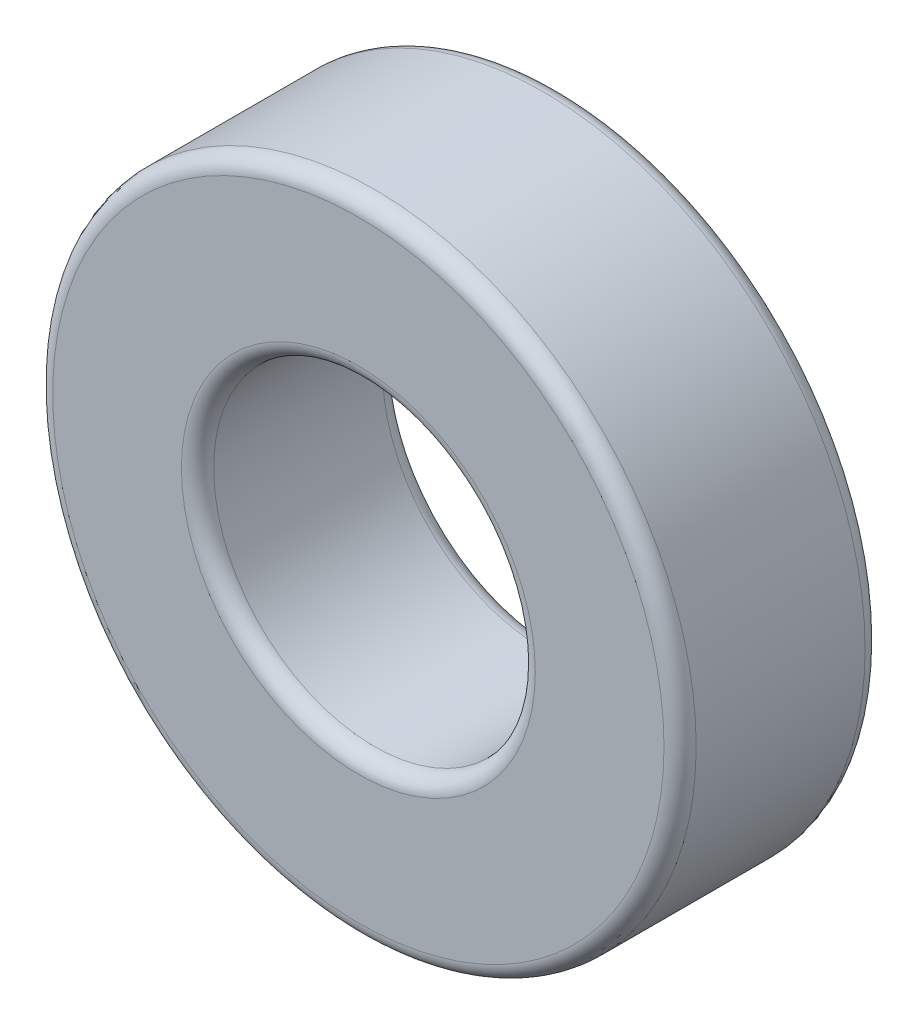
ISO-10303-21;
HEADER;
FILE_DESCRIPTION(('STEP AP214'),'2;1');
FILE_NAME('part.step','',(''),(''),'','','');
FILE_SCHEMA(('AUTOMOTIVE_DESIGN { 1 0 10303 214 1 1 1 1 }'));
ENDSEC;
DATA;
#1=APPLICATION_CONTEXT('core data for automotive mechanical design processes');
#2=APPLICATION_PROTOCOL_DEFINITION('international standard','automotive_design',2000,#1);
#3=PRODUCT_CONTEXT('',#1,'mechanical');
#4=PRODUCT('Part','Part','',(#3));
#5=PRODUCT_RELATED_PRODUCT_CATEGORY('part','',(#4));
#6=PRODUCT_DEFINITION_FORMATION('','',#4);
#7=PRODUCT_DEFINITION_CONTEXT('part definition',#1,'design');
#8=PRODUCT_DEFINITION('design','',#6,#7);
#9=PRODUCT_DEFINITION_SHAPE('','',#8);
#10=(LENGTH_UNIT() NAMED_UNIT(*) SI_UNIT(.MILLI.,.METRE.));
#11=(NAMED_UNIT(*) PLANE_ANGLE_UNIT() SI_UNIT($,.RADIAN.));
#12=(NAMED_UNIT(*) SI_UNIT($,.STERADIAN.) SOLID_ANGLE_UNIT());
#13=UNCERTAINTY_MEASURE_WITH_UNIT(LENGTH_MEASURE(1.E-05),#10,'distance_accuracy_value','');
#14=(GEOMETRIC_REPRESENTATION_CONTEXT(3) GLOBAL_UNCERTAINTY_ASSIGNED_CONTEXT((#13)) GLOBAL_UNIT_ASSIGNED_CONTEXT((#10,
#11,#12)) REPRESENTATION_CONTEXT('',''));
#15=CARTESIAN_POINT('',(0.,0.,0.));
#16=DIRECTION('',(0.,0.,1.));
#17=DIRECTION('',(1.,0.,0.));
#18=AXIS2_PLACEMENT_3D('',#15,#16,#17);
#19=CARTESIAN_POINT('',(60.3855008959128,2.91523939342328,2.5));
#20=DIRECTION('',(0.,0.,-1.));
#21=DIRECTION('',(-1.,0.,0.));
#22=AXIS2_PLACEMENT_3D('',#19,#20,#21);
#23=CYLINDRICAL_SURFACE('',#22,4.00000000000001);
#24=CARTESIAN_POINT('',(60.3855008959128,2.91523939342328,2.3));
#25=DIRECTION('',(0.,0.,1.));
#26=DIRECTION('',(1.,0.,0.));
#27=AXIS2_PLACEMENT_3D('',#24,#25,#26);
#28=CIRCLE('',#27,4.00000000000001);
#29=CARTESIAN_POINT('',(64.3855008959128,2.91523939342328,2.3));
#30=VERTEX_POINT('',#29);
#31=EDGE_CURVE('E43',#30,#30,#28,.F.);
#32=ORIENTED_EDGE('',*,*,#31,.T.);
#33=EDGE_LOOP('',(#32));
#34=FACE_BOUND('',#33,.T.);
#35=CARTESIAN_POINT('',(60.3855008959128,2.91523939342328,0.2));
#36=DIRECTION('',(0.,0.,1.));
#37=DIRECTION('',(1.,0.,0.));
#38=AXIS2_PLACEMENT_3D('',#35,#36,#37);
#39=CIRCLE('',#38,4.00000000000001);
#40=CARTESIAN_POINT('',(64.3855008959128,2.91523939342328,0.2));
#41=VERTEX_POINT('',#40);
#42=EDGE_CURVE('E47',#41,#41,#39,.T.);
#43=ORIENTED_EDGE('',*,*,#42,.T.);
#44=EDGE_LOOP('',(#43));
#45=FACE_BOUND('',#44,.T.);
#46=ADVANCED_FACE('F32',(#34,#45),#23,.T.);
#47=CARTESIAN_POINT('',(60.3855008959128,2.91523939342328,2.5));
#48=DIRECTION('',(0.,0.,1.));
#49=DIRECTION('',(1.,0.,0.));
#50=AXIS2_PLACEMENT_3D('',#47,#48,#49);
#51=PLANE('',#50);
#52=CARTESIAN_POINT('',(60.3855008959128,2.91523939342328,2.5));
#53=DIRECTION('',(0.,0.,1.));
#54=DIRECTION('',(1.,0.,0.));
#55=AXIS2_PLACEMENT_3D('',#52,#53,#54);
#56=CIRCLE('',#55,2.2);
#57=CARTESIAN_POINT('',(62.5855008959128,2.91523939342328,2.5));
#58=VERTEX_POINT('',#57);
#59=EDGE_CURVE('E52',#58,#58,#56,.F.);
#60=ORIENTED_EDGE('',*,*,#59,.T.);
#61=EDGE_LOOP('',(#60));
#62=FACE_BOUND('',#61,.T.);
#63=CARTESIAN_POINT('',(60.3855008959128,2.91523939342328,2.5));
#64=DIRECTION('',(0.,0.,1.));
#65=DIRECTION('',(1.,0.,0.));
#66=AXIS2_PLACEMENT_3D('',#63,#64,#65);
#67=CIRCLE('',#66,3.80000000000001);
#68=CARTESIAN_POINT('',(64.1855008959128,2.91523939342328,2.5));
#69=VERTEX_POINT('',#68);
#70=EDGE_CURVE('E55',#69,#69,#67,.T.);
#71=ORIENTED_EDGE('',*,*,#70,.T.);
#72=EDGE_LOOP('',(#71));
#73=FACE_BOUND('',#72,.T.);
#74=ADVANCED_FACE('F80',(#62,#73),#51,.T.);
#75=CARTESIAN_POINT('',(60.3855008959128,2.91523939342328,0.));
#76=DIRECTION('',(0.,0.,1.));
#77=DIRECTION('',(1.,0.,0.));
#78=AXIS2_PLACEMENT_3D('',#75,#76,#77);
#79=PLANE('',#78);
#80=CARTESIAN_POINT('',(60.3855008959128,2.91523939342328,0.));
#81=DIRECTION('',(0.,0.,1.));
#82=DIRECTION('',(1.,0.,0.));
#83=AXIS2_PLACEMENT_3D('',#80,#81,#82);
#84=CIRCLE('',#83,2.2);
#85=CARTESIAN_POINT('',(62.5855008959128,2.91523939342328,0.));
#86=VERTEX_POINT('',#85);
#87=EDGE_CURVE('E10',#86,#86,#84,.T.);
#88=ORIENTED_EDGE('',*,*,#87,.T.);
#89=EDGE_LOOP('',(#88));
#90=FACE_BOUND('',#89,.T.);
#91=CARTESIAN_POINT('',(60.3855008959128,2.91523939342328,0.));
#92=DIRECTION('',(0.,0.,1.));
#93=DIRECTION('',(1.,0.,0.));
#94=AXIS2_PLACEMENT_3D('',#91,#92,#93);
#95=CIRCLE('',#94,3.80000000000001);
#96=CARTESIAN_POINT('',(64.1855008959128,2.91523939342328,0.));
#97=VERTEX_POINT('',#96);
#98=EDGE_CURVE('E39',#97,#97,#95,.F.);
#99=ORIENTED_EDGE('',*,*,#98,.T.);
#100=EDGE_LOOP('',(#99));
#101=FACE_BOUND('',#100,.T.);
#102=ADVANCED_FACE('F86',(#90,#101),#79,.F.);
#103=CARTESIAN_POINT('',(60.3855008959128,2.91523939342328,4.));
#104=DIRECTION('',(0.,0.,-1.));
#105=DIRECTION('',(-1.,0.,0.));
#106=AXIS2_PLACEMENT_3D('',#103,#104,#105);
#107=CYLINDRICAL_SURFACE('',#106,2.);
#108=CARTESIAN_POINT('',(60.3855008959128,2.91523939342328,2.3));
#109=DIRECTION('',(0.,0.,1.));
#110=DIRECTION('',(1.,0.,0.));
#111=AXIS2_PLACEMENT_3D('',#108,#109,#110);
#112=CIRCLE('',#111,2.);
#113=CARTESIAN_POINT('',(62.3855008959128,2.91523939342328,2.3));
#114=VERTEX_POINT('',#113);
#115=EDGE_CURVE('E58',#114,#114,#112,.T.);
#116=ORIENTED_EDGE('',*,*,#115,.T.);
#117=EDGE_LOOP('',(#116));
#118=FACE_BOUND('',#117,.T.);
#119=CARTESIAN_POINT('',(60.3855008959128,2.91523939342328,0.2));
#120=DIRECTION('',(0.,0.,1.));
#121=DIRECTION('',(1.,0.,0.));
#122=AXIS2_PLACEMENT_3D('',#119,#120,#121);
#123=CIRCLE('',#122,2.);
#124=CARTESIAN_POINT('',(62.3855008959128,2.91523939342328,0.2));
#125=VERTEX_POINT('',#124);
#126=EDGE_CURVE('E61',#125,#125,#123,.F.);
#127=ORIENTED_EDGE('',*,*,#126,.T.);
#128=EDGE_LOOP('',(#127));
#129=FACE_BOUND('',#128,.T.);
#130=ADVANCED_FACE('F65',(#118,#129),#107,.F.);
#131=CARTESIAN_POINT('',(60.3855008959128,2.91523939342328,2.3));
#132=DIRECTION('',(0.,0.,1.));
#133=DIRECTION('',(1.,0.,0.));
#134=AXIS2_PLACEMENT_3D('',#131,#132,#133);
#135=TOROIDAL_SURFACE('',#134,2.2,0.2);
#136=ORIENTED_EDGE('',*,*,#59,.F.);
#137=EDGE_LOOP('',(#136));
#138=FACE_BOUND('',#137,.T.);
#139=ORIENTED_EDGE('',*,*,#115,.F.);
#140=EDGE_LOOP('',(#139));
#141=FACE_BOUND('',#140,.T.);
#142=ADVANCED_FACE('F76',(#138,#141),#135,.T.);
#143=CARTESIAN_POINT('',(60.3855008959128,2.91523939342328,2.3));
#144=DIRECTION('',(0.,0.,1.));
#145=DIRECTION('',(1.,0.,0.));
#146=AXIS2_PLACEMENT_3D('',#143,#144,#145);
#147=TOROIDAL_SURFACE('',#146,3.80000000000001,0.2);
#148=ORIENTED_EDGE('',*,*,#31,.F.);
#149=EDGE_LOOP('',(#148));
#150=FACE_BOUND('',#149,.T.);
#151=ORIENTED_EDGE('',*,*,#70,.F.);
#152=EDGE_LOOP('',(#151));
#153=FACE_BOUND('',#152,.T.);
#154=ADVANCED_FACE('F69',(#150,#153),#147,.T.);
#155=CARTESIAN_POINT('',(60.3855008959128,2.91523939342328,0.2));
#156=DIRECTION('',(0.,0.,1.));
#157=DIRECTION('',(1.,0.,0.));
#158=AXIS2_PLACEMENT_3D('',#155,#156,#157);
#159=TOROIDAL_SURFACE('',#158,2.2,0.2);
#160=ORIENTED_EDGE('',*,*,#87,.F.);
#161=EDGE_LOOP('',(#160));
#162=FACE_BOUND('',#161,.T.);
#163=ORIENTED_EDGE('',*,*,#126,.F.);
#164=EDGE_LOOP('',(#163));
#165=FACE_BOUND('',#164,.T.);
#166=ADVANCED_FACE('F67',(#162,#165),#159,.T.);
#167=CARTESIAN_POINT('',(60.3855008959128,2.91523939342328,0.2));
#168=DIRECTION('',(0.,0.,1.));
#169=DIRECTION('',(1.,0.,0.));
#170=AXIS2_PLACEMENT_3D('',#167,#168,#169);
#171=TOROIDAL_SURFACE('',#170,3.80000000000001,0.2);
#172=ORIENTED_EDGE('',*,*,#98,.F.);
#173=EDGE_LOOP('',(#172));
#174=FACE_BOUND('',#173,.T.);
#175=ORIENTED_EDGE('',*,*,#42,.F.);
#176=EDGE_LOOP('',(#175));
#177=FACE_BOUND('',#176,.T.);
#178=ADVANCED_FACE('F34',(#174,#177),#171,.T.);
#179=CLOSED_SHELL('',(#46,#74,#102,#130,#142,#154,#166,#178));
#180=MANIFOLD_SOLID_BREP('B2',#179);
#181=ADVANCED_BREP_SHAPE_REPRESENTATION('',(#18,#180),#14);
#182=SHAPE_DEFINITION_REPRESENTATION(#9,#181);
ENDSEC;
END-ISO-10303-21;
